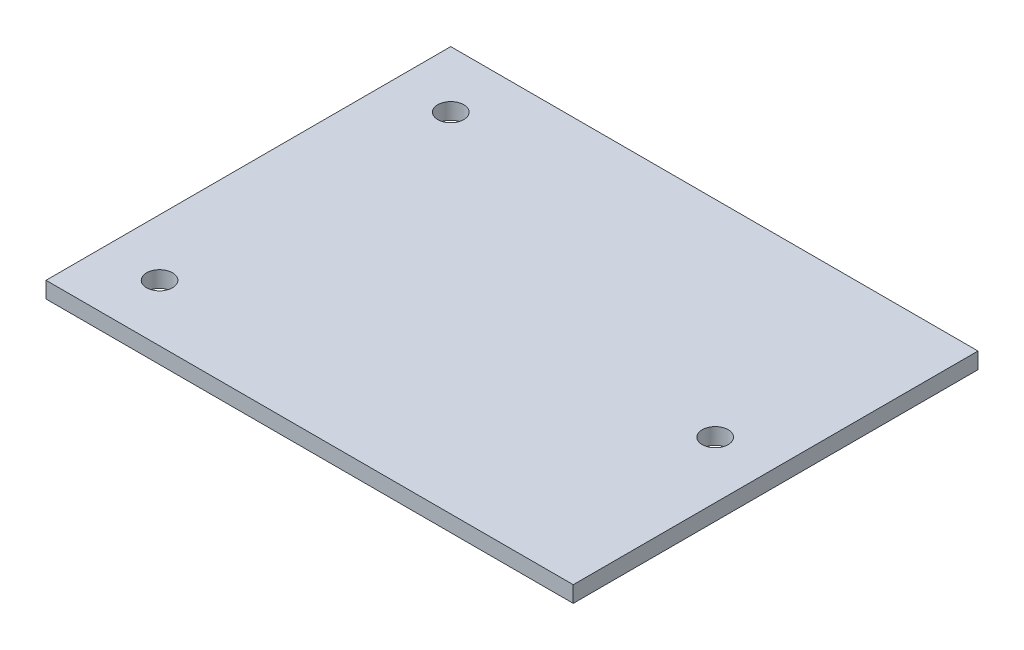
ISO-10303-21;
HEADER;
FILE_DESCRIPTION(('STEP AP214'),'2;1');
FILE_NAME('part.step','',(''),(''),'','','');
FILE_SCHEMA(('AUTOMOTIVE_DESIGN { 1 0 10303 214 1 1 1 1 }'));
ENDSEC;
DATA;
#1=APPLICATION_CONTEXT('core data for automotive mechanical design processes');
#2=APPLICATION_PROTOCOL_DEFINITION('international standard','automotive_design',2000,#1);
#3=PRODUCT_CONTEXT('',#1,'mechanical');
#4=PRODUCT('Part','Part','',(#3));
#5=PRODUCT_RELATED_PRODUCT_CATEGORY('part','',(#4));
#6=PRODUCT_DEFINITION_FORMATION('','',#4);
#7=PRODUCT_DEFINITION_CONTEXT('part definition',#1,'design');
#8=PRODUCT_DEFINITION('design','',#6,#7);
#9=PRODUCT_DEFINITION_SHAPE('','',#8);
#10=(LENGTH_UNIT() NAMED_UNIT(*) SI_UNIT(.MILLI.,.METRE.));
#11=(NAMED_UNIT(*) PLANE_ANGLE_UNIT() SI_UNIT($,.RADIAN.));
#12=(NAMED_UNIT(*) SI_UNIT($,.STERADIAN.) SOLID_ANGLE_UNIT());
#13=UNCERTAINTY_MEASURE_WITH_UNIT(LENGTH_MEASURE(1.E-05),#10,'distance_accuracy_value','');
#14=(GEOMETRIC_REPRESENTATION_CONTEXT(3) GLOBAL_UNCERTAINTY_ASSIGNED_CONTEXT((#13)) GLOBAL_UNIT_ASSIGNED_CONTEXT((#10,
#11,#12)) REPRESENTATION_CONTEXT('',''));
#15=CARTESIAN_POINT('',(0.,0.,0.));
#16=DIRECTION('',(0.,0.,1.));
#17=DIRECTION('',(1.,0.,0.));
#18=AXIS2_PLACEMENT_3D('',#15,#16,#17);
#19=CARTESIAN_POINT('',(0.,2.,0.));
#20=DIRECTION('',(0.,1.,0.));
#21=DIRECTION('',(0.,0.,1.));
#22=AXIS2_PLACEMENT_3D('',#19,#20,#21);
#23=PLANE('',#22);
#24=CARTESIAN_POINT('',(-19.6412212641501,2.,17.95));
#25=DIRECTION('',(0.,1.,0.));
#26=DIRECTION('',(0.,0.,-1.));
#27=AXIS2_PLACEMENT_3D('',#24,#25,#26);
#28=CIRCLE('',#27,1.6);
#29=CARTESIAN_POINT('',(-19.6412212641501,2.,16.35));
#30=VERTEX_POINT('',#29);
#31=EDGE_CURVE('E125',#30,#30,#28,.T.);
#32=ORIENTED_EDGE('',*,*,#31,.F.);
#33=EDGE_LOOP('',(#32));
#34=FACE_BOUND('',#33,.T.);
#35=DIRECTION('',(0.,0.,-1.));
#36=VECTOR('',#35,1.);
#37=CARTESIAN_POINT('',(38.3587787358499,2.,24.95));
#38=LINE('',#37,#36);
#39=CARTESIAN_POINT('',(38.3587787358499,2.,24.95));
#40=VERTEX_POINT('',#39);
#41=CARTESIAN_POINT('',(38.3587787358499,2.,-24.95));
#42=VERTEX_POINT('',#41);
#43=EDGE_CURVE('E95',#40,#42,#38,.T.);
#44=ORIENTED_EDGE('',*,*,#43,.T.);
#45=DIRECTION('',(-1.,0.,0.));
#46=VECTOR('',#45,1.);
#47=CARTESIAN_POINT('',(38.3587787358499,2.,-24.95));
#48=LINE('',#47,#46);
#49=CARTESIAN_POINT('',(-26.6412212641501,2.,-24.95));
#50=VERTEX_POINT('',#49);
#51=EDGE_CURVE('E90',#42,#50,#48,.T.);
#52=ORIENTED_EDGE('',*,*,#51,.T.);
#53=DIRECTION('',(0.,0.,1.));
#54=VECTOR('',#53,1.);
#55=CARTESIAN_POINT('',(-26.6412212641501,2.,24.95));
#56=LINE('',#55,#54);
#57=CARTESIAN_POINT('',(-26.6412212641501,2.,24.95));
#58=VERTEX_POINT('',#57);
#59=EDGE_CURVE('E93',#50,#58,#56,.T.);
#60=ORIENTED_EDGE('',*,*,#59,.T.);
#61=DIRECTION('',(1.,0.,0.));
#62=VECTOR('',#61,1.);
#63=CARTESIAN_POINT('',(38.3587787358499,2.,24.95));
#64=LINE('',#63,#62);
#65=EDGE_CURVE('E60',#58,#40,#64,.T.);
#66=ORIENTED_EDGE('',*,*,#65,.T.);
#67=EDGE_LOOP('',(#44,#52,#60,#66));
#68=FACE_BOUND('',#67,.T.);
#69=CARTESIAN_POINT('',(-19.6412212641501,2.,-17.95));
#70=DIRECTION('',(0.,1.,0.));
#71=DIRECTION('',(0.,0.,1.));
#72=AXIS2_PLACEMENT_3D('',#69,#70,#71);
#73=CIRCLE('',#72,1.6);
#74=CARTESIAN_POINT('',(-19.6412212641501,2.,-16.35));
#75=VERTEX_POINT('',#74);
#76=EDGE_CURVE('E110',#75,#75,#73,.T.);
#77=ORIENTED_EDGE('',*,*,#76,.F.);
#78=EDGE_LOOP('',(#77));
#79=FACE_BOUND('',#78,.T.);
#80=CARTESIAN_POINT('',(31.3587787358499,2.,0.449999999999996));
#81=DIRECTION('',(0.,1.,0.));
#82=DIRECTION('',(0.,0.,1.));
#83=AXIS2_PLACEMENT_3D('',#80,#81,#82);
#84=CIRCLE('',#83,1.6);
#85=CARTESIAN_POINT('',(31.3587787358499,2.,2.05));
#86=VERTEX_POINT('',#85);
#87=EDGE_CURVE('E131',#86,#86,#84,.T.);
#88=ORIENTED_EDGE('',*,*,#87,.F.);
#89=EDGE_LOOP('',(#88));
#90=FACE_BOUND('',#89,.T.);
#91=ADVANCED_FACE('F43',(#34,#68,#79,#90),#23,.T.);
#92=CARTESIAN_POINT('',(0.,0.,0.));
#93=DIRECTION('',(0.,1.,0.));
#94=DIRECTION('',(0.,0.,1.));
#95=AXIS2_PLACEMENT_3D('',#92,#93,#94);
#96=PLANE('',#95);
#97=DIRECTION('',(0.,0.,-1.));
#98=VECTOR('',#97,1.);
#99=CARTESIAN_POINT('',(38.3587787358499,0.,24.95));
#100=LINE('',#99,#98);
#101=CARTESIAN_POINT('',(38.3587787358499,0.,24.95));
#102=VERTEX_POINT('',#101);
#103=CARTESIAN_POINT('',(38.3587787358499,0.,-24.95));
#104=VERTEX_POINT('',#103);
#105=EDGE_CURVE('E107',#102,#104,#100,.T.);
#106=ORIENTED_EDGE('',*,*,#105,.F.);
#107=DIRECTION('',(1.,0.,0.));
#108=VECTOR('',#107,1.);
#109=CARTESIAN_POINT('',(38.3587787358499,0.,24.95));
#110=LINE('',#109,#108);
#111=CARTESIAN_POINT('',(-26.6412212641501,0.,24.95));
#112=VERTEX_POINT('',#111);
#113=EDGE_CURVE('E83',#112,#102,#110,.T.);
#114=ORIENTED_EDGE('',*,*,#113,.F.);
#115=DIRECTION('',(0.,0.,1.));
#116=VECTOR('',#115,1.);
#117=CARTESIAN_POINT('',(-26.6412212641501,0.,24.95));
#118=LINE('',#117,#116);
#119=CARTESIAN_POINT('',(-26.6412212641501,0.,-24.95));
#120=VERTEX_POINT('',#119);
#121=EDGE_CURVE('E77',#120,#112,#118,.T.);
#122=ORIENTED_EDGE('',*,*,#121,.F.);
#123=DIRECTION('',(-1.,0.,0.));
#124=VECTOR('',#123,1.);
#125=CARTESIAN_POINT('',(38.3587787358499,0.,-24.95));
#126=LINE('',#125,#124);
#127=EDGE_CURVE('E99',#104,#120,#126,.T.);
#128=ORIENTED_EDGE('',*,*,#127,.F.);
#129=EDGE_LOOP('',(#106,#114,#122,#128));
#130=FACE_BOUND('',#129,.T.);
#131=CARTESIAN_POINT('',(-19.6412212641501,0.,-17.95));
#132=DIRECTION('',(0.,1.,0.));
#133=DIRECTION('',(0.,0.,1.));
#134=AXIS2_PLACEMENT_3D('',#131,#132,#133);
#135=CIRCLE('',#134,1.6);
#136=CARTESIAN_POINT('',(-19.6412212641501,0.,-16.35));
#137=VERTEX_POINT('',#136);
#138=EDGE_CURVE('E122',#137,#137,#135,.T.);
#139=ORIENTED_EDGE('',*,*,#138,.T.);
#140=EDGE_LOOP('',(#139));
#141=FACE_BOUND('',#140,.T.);
#142=CARTESIAN_POINT('',(-19.6412212641501,0.,17.95));
#143=DIRECTION('',(0.,1.,0.));
#144=DIRECTION('',(0.,0.,-1.));
#145=AXIS2_PLACEMENT_3D('',#142,#143,#144);
#146=CIRCLE('',#145,1.6);
#147=CARTESIAN_POINT('',(-19.6412212641501,0.,16.35));
#148=VERTEX_POINT('',#147);
#149=EDGE_CURVE('E128',#148,#148,#146,.T.);
#150=ORIENTED_EDGE('',*,*,#149,.T.);
#151=EDGE_LOOP('',(#150));
#152=FACE_BOUND('',#151,.T.);
#153=CARTESIAN_POINT('',(31.3587787358499,0.,0.449999999999996));
#154=DIRECTION('',(0.,1.,0.));
#155=DIRECTION('',(0.,0.,1.));
#156=AXIS2_PLACEMENT_3D('',#153,#154,#155);
#157=CIRCLE('',#156,1.6);
#158=CARTESIAN_POINT('',(31.3587787358499,0.,2.05));
#159=VERTEX_POINT('',#158);
#160=EDGE_CURVE('E134',#159,#159,#157,.T.);
#161=ORIENTED_EDGE('',*,*,#160,.T.);
#162=EDGE_LOOP('',(#161));
#163=FACE_BOUND('',#162,.T.);
#164=ADVANCED_FACE('F118',(#130,#141,#152,#163),#96,.F.);
#165=CARTESIAN_POINT('',(38.3587787358499,2.,24.95));
#166=DIRECTION('',(-1.,0.,0.));
#167=DIRECTION('',(0.,0.,1.));
#168=AXIS2_PLACEMENT_3D('',#165,#166,#167);
#169=PLANE('',#168);
#170=ORIENTED_EDGE('',*,*,#105,.T.);
#171=DIRECTION('',(0.,-1.,0.));
#172=VECTOR('',#171,1.);
#173=CARTESIAN_POINT('',(38.3587787358499,2.,-24.95));
#174=LINE('',#173,#172);
#175=EDGE_CURVE('E11',#42,#104,#174,.T.);
#176=ORIENTED_EDGE('',*,*,#175,.F.);
#177=ORIENTED_EDGE('',*,*,#43,.F.);
#178=DIRECTION('',(0.,-1.,0.));
#179=VECTOR('',#178,1.);
#180=CARTESIAN_POINT('',(38.3587787358499,2.,24.95));
#181=LINE('',#180,#179);
#182=EDGE_CURVE('E103',#40,#102,#181,.T.);
#183=ORIENTED_EDGE('',*,*,#182,.T.);
#184=EDGE_LOOP('',(#170,#176,#177,#183));
#185=FACE_BOUND('',#184,.T.);
#186=ADVANCED_FACE('F45',(#185),#169,.F.);
#187=CARTESIAN_POINT('',(38.3587787358499,2.,-24.95));
#188=DIRECTION('',(0.,0.,1.));
#189=DIRECTION('',(1.,0.,0.));
#190=AXIS2_PLACEMENT_3D('',#187,#188,#189);
#191=PLANE('',#190);
#192=ORIENTED_EDGE('',*,*,#127,.T.);
#193=DIRECTION('',(0.,-1.,0.));
#194=VECTOR('',#193,1.);
#195=CARTESIAN_POINT('',(-26.6412212641501,2.,-24.95));
#196=LINE('',#195,#194);
#197=EDGE_CURVE('E52',#50,#120,#196,.T.);
#198=ORIENTED_EDGE('',*,*,#197,.F.);
#199=ORIENTED_EDGE('',*,*,#51,.F.);
#200=ORIENTED_EDGE('',*,*,#175,.T.);
#201=EDGE_LOOP('',(#192,#198,#199,#200));
#202=FACE_BOUND('',#201,.T.);
#203=ADVANCED_FACE('F98',(#202),#191,.F.);
#204=CARTESIAN_POINT('',(-26.6412212641501,2.,24.95));
#205=DIRECTION('',(1.,0.,0.));
#206=DIRECTION('',(0.,0.,-1.));
#207=AXIS2_PLACEMENT_3D('',#204,#205,#206);
#208=PLANE('',#207);
#209=ORIENTED_EDGE('',*,*,#121,.T.);
#210=DIRECTION('',(0.,-1.,0.));
#211=VECTOR('',#210,1.);
#212=CARTESIAN_POINT('',(-26.6412212641501,2.,24.95));
#213=LINE('',#212,#211);
#214=EDGE_CURVE('E100',#58,#112,#213,.T.);
#215=ORIENTED_EDGE('',*,*,#214,.F.);
#216=ORIENTED_EDGE('',*,*,#59,.F.);
#217=ORIENTED_EDGE('',*,*,#197,.T.);
#218=EDGE_LOOP('',(#209,#215,#216,#217));
#219=FACE_BOUND('',#218,.T.);
#220=ADVANCED_FACE('F101',(#219),#208,.F.);
#221=CARTESIAN_POINT('',(38.3587787358499,2.,24.95));
#222=DIRECTION('',(0.,0.,-1.));
#223=DIRECTION('',(-1.,0.,0.));
#224=AXIS2_PLACEMENT_3D('',#221,#222,#223);
#225=PLANE('',#224);
#226=ORIENTED_EDGE('',*,*,#113,.T.);
#227=ORIENTED_EDGE('',*,*,#182,.F.);
#228=ORIENTED_EDGE('',*,*,#65,.F.);
#229=ORIENTED_EDGE('',*,*,#214,.T.);
#230=EDGE_LOOP('',(#226,#227,#228,#229));
#231=FACE_BOUND('',#230,.T.);
#232=ADVANCED_FACE('F115',(#231),#225,.F.);
#233=CARTESIAN_POINT('',(-19.6412212641501,2.,-17.95));
#234=DIRECTION('',(0.,-1.,0.));
#235=DIRECTION('',(0.,0.,-1.));
#236=AXIS2_PLACEMENT_3D('',#233,#234,#235);
#237=CYLINDRICAL_SURFACE('',#236,1.6);
#238=ORIENTED_EDGE('',*,*,#76,.T.);
#239=EDGE_LOOP('',(#238));
#240=FACE_BOUND('',#239,.T.);
#241=ORIENTED_EDGE('',*,*,#138,.F.);
#242=EDGE_LOOP('',(#241));
#243=FACE_BOUND('',#242,.T.);
#244=ADVANCED_FACE('F152',(#240,#243),#237,.F.);
#245=CARTESIAN_POINT('',(-19.6412212641501,2.,17.95));
#246=DIRECTION('',(0.,-1.,0.));
#247=DIRECTION('',(0.,0.,-1.));
#248=AXIS2_PLACEMENT_3D('',#245,#246,#247);
#249=CYLINDRICAL_SURFACE('',#248,1.6);
#250=ORIENTED_EDGE('',*,*,#31,.T.);
#251=EDGE_LOOP('',(#250));
#252=FACE_BOUND('',#251,.T.);
#253=ORIENTED_EDGE('',*,*,#149,.F.);
#254=EDGE_LOOP('',(#253));
#255=FACE_BOUND('',#254,.T.);
#256=ADVANCED_FACE('F197',(#252,#255),#249,.F.);
#257=CARTESIAN_POINT('',(31.3587787358499,2.,0.449999999999996));
#258=DIRECTION('',(0.,-1.,0.));
#259=DIRECTION('',(0.,0.,-1.));
#260=AXIS2_PLACEMENT_3D('',#257,#258,#259);
#261=CYLINDRICAL_SURFACE('',#260,1.6);
#262=ORIENTED_EDGE('',*,*,#87,.T.);
#263=EDGE_LOOP('',(#262));
#264=FACE_BOUND('',#263,.T.);
#265=ORIENTED_EDGE('',*,*,#160,.F.);
#266=EDGE_LOOP('',(#265));
#267=FACE_BOUND('',#266,.T.);
#268=ADVANCED_FACE('F140',(#264,#267),#261,.F.);
#269=CLOSED_SHELL('',(#91,#164,#186,#203,#220,#232,#244,#256,#268));
#270=MANIFOLD_SOLID_BREP('B2',#269);
#271=ADVANCED_BREP_SHAPE_REPRESENTATION('',(#18,#270),#14);
#272=SHAPE_DEFINITION_REPRESENTATION(#9,#271);
ENDSEC;
END-ISO-10303-21;
